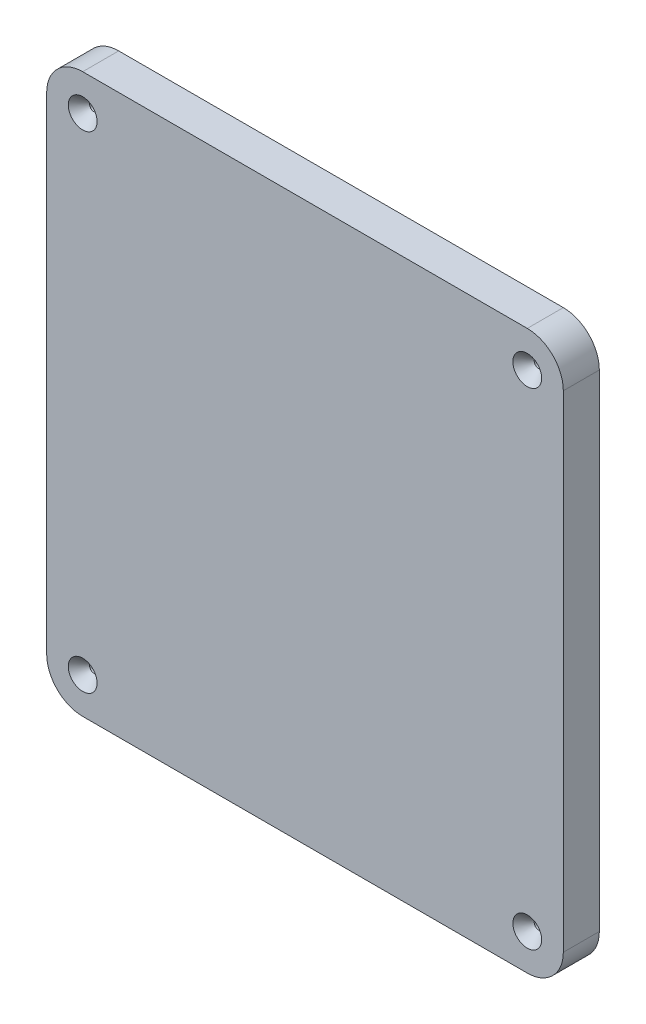
ISO-10303-21;
HEADER;
FILE_DESCRIPTION(('STEP AP214'),'2;1');
FILE_NAME('part.step','',(''),(''),'','','');
FILE_SCHEMA(('AUTOMOTIVE_DESIGN { 1 0 10303 214 1 1 1 1 }'));
ENDSEC;
DATA;
#1=APPLICATION_CONTEXT('core data for automotive mechanical design processes');
#2=APPLICATION_PROTOCOL_DEFINITION('international standard','automotive_design',2000,#1);
#3=PRODUCT_CONTEXT('',#1,'mechanical');
#4=PRODUCT('Part','Part','',(#3));
#5=PRODUCT_RELATED_PRODUCT_CATEGORY('part','',(#4));
#6=PRODUCT_DEFINITION_FORMATION('','',#4);
#7=PRODUCT_DEFINITION_CONTEXT('part definition',#1,'design');
#8=PRODUCT_DEFINITION('design','',#6,#7);
#9=PRODUCT_DEFINITION_SHAPE('','',#8);
#10=(LENGTH_UNIT() NAMED_UNIT(*) SI_UNIT(.MILLI.,.METRE.));
#11=(NAMED_UNIT(*) PLANE_ANGLE_UNIT() SI_UNIT($,.RADIAN.));
#12=(NAMED_UNIT(*) SI_UNIT($,.STERADIAN.) SOLID_ANGLE_UNIT());
#13=UNCERTAINTY_MEASURE_WITH_UNIT(LENGTH_MEASURE(1.E-05),#10,'distance_accuracy_value','');
#14=(GEOMETRIC_REPRESENTATION_CONTEXT(3) GLOBAL_UNCERTAINTY_ASSIGNED_CONTEXT((#13)) GLOBAL_UNIT_ASSIGNED_CONTEXT((#10,
#11,#12)) REPRESENTATION_CONTEXT('',''));
#15=CARTESIAN_POINT('',(0.,0.,0.));
#16=DIRECTION('',(0.,0.,1.));
#17=DIRECTION('',(1.,0.,0.));
#18=AXIS2_PLACEMENT_3D('',#15,#16,#17);
#19=CARTESIAN_POINT('',(-43.099999993993,668.077163009698,12.7));
#20=DIRECTION('',(0.,1.,0.));
#21=DIRECTION('',(-1.,0.,0.));
#22=AXIS2_PLACEMENT_3D('',#19,#20,#21);
#23=PLANE('',#22);
#24=DIRECTION('',(1.,0.,0.));
#25=VECTOR('',#24,1.);
#26=CARTESIAN_POINT('',(-43.099999993993,668.077163009698,0.));
#27=LINE('',#26,#25);
#28=CARTESIAN_POINT('',(-30.3999999939932,668.077163009698,0.));
#29=VERTEX_POINT('',#28);
#30=CARTESIAN_POINT('',(126.350000000009,668.077163009696,0.));
#31=VERTEX_POINT('',#30);
#32=EDGE_CURVE('E135',#29,#31,#27,.T.);
#33=ORIENTED_EDGE('',*,*,#32,.T.);
#34=DIRECTION('',(0.,0.,-1.));
#35=VECTOR('',#34,1.);
#36=CARTESIAN_POINT('',(126.350000000009,668.077163009696,12.7));
#37=LINE('',#36,#35);
#38=CARTESIAN_POINT('',(126.350000000009,668.077163009696,12.7));
#39=VERTEX_POINT('',#38);
#40=EDGE_CURVE('E158',#31,#39,#37,.F.);
#41=ORIENTED_EDGE('',*,*,#40,.T.);
#42=DIRECTION('',(1.,0.,0.));
#43=VECTOR('',#42,1.);
#44=CARTESIAN_POINT('',(-43.099999993993,668.077163009698,12.7));
#45=LINE('',#44,#43);
#46=CARTESIAN_POINT('',(-30.3999999939932,668.077163009698,12.7));
#47=VERTEX_POINT('',#46);
#48=EDGE_CURVE('E133',#47,#39,#45,.T.);
#49=ORIENTED_EDGE('',*,*,#48,.F.);
#50=DIRECTION('',(0.,0.,-1.));
#51=VECTOR('',#50,1.);
#52=CARTESIAN_POINT('',(-30.3999999939932,668.077163009698,12.7));
#53=LINE('',#52,#51);
#54=EDGE_CURVE('E155',#47,#29,#53,.T.);
#55=ORIENTED_EDGE('',*,*,#54,.T.);
#56=EDGE_LOOP('',(#33,#41,#49,#55));
#57=FACE_BOUND('',#56,.T.);
#58=ADVANCED_FACE('F38',(#57),#23,.F.);
#59=CARTESIAN_POINT('',(139.050000000009,668.077163009696,12.7));
#60=DIRECTION('',(-1.,0.,0.));
#61=DIRECTION('',(0.,-1.,0.));
#62=AXIS2_PLACEMENT_3D('',#59,#60,#61);
#63=PLANE('',#62);
#64=DIRECTION('',(0.,1.,0.));
#65=VECTOR('',#64,1.);
#66=CARTESIAN_POINT('',(139.050000000009,668.077163009696,0.));
#67=LINE('',#66,#65);
#68=CARTESIAN_POINT('',(139.050000000009,680.777163009696,0.));
#69=VERTEX_POINT('',#68);
#70=CARTESIAN_POINT('',(139.050000000009,852.227163009696,0.));
#71=VERTEX_POINT('',#70);
#72=EDGE_CURVE('E131',#69,#71,#67,.T.);
#73=ORIENTED_EDGE('',*,*,#72,.T.);
#74=DIRECTION('',(0.,0.,-1.));
#75=VECTOR('',#74,1.);
#76=CARTESIAN_POINT('',(139.050000000009,852.227163009696,12.7));
#77=LINE('',#76,#75);
#78=CARTESIAN_POINT('',(139.050000000009,852.227163009696,12.7));
#79=VERTEX_POINT('',#78);
#80=EDGE_CURVE('E110',#71,#79,#77,.F.);
#81=ORIENTED_EDGE('',*,*,#80,.T.);
#82=DIRECTION('',(0.,1.,0.));
#83=VECTOR('',#82,1.);
#84=CARTESIAN_POINT('',(139.050000000009,668.077163009696,12.7));
#85=LINE('',#84,#83);
#86=CARTESIAN_POINT('',(139.050000000009,680.777163009696,12.7));
#87=VERTEX_POINT('',#86);
#88=EDGE_CURVE('E195',#87,#79,#85,.T.);
#89=ORIENTED_EDGE('',*,*,#88,.F.);
#90=DIRECTION('',(0.,0.,-1.));
#91=VECTOR('',#90,1.);
#92=CARTESIAN_POINT('',(139.050000000009,680.777163009696,12.7));
#93=LINE('',#92,#91);
#94=EDGE_CURVE('E115',#87,#69,#93,.T.);
#95=ORIENTED_EDGE('',*,*,#94,.T.);
#96=EDGE_LOOP('',(#73,#81,#89,#95));
#97=FACE_BOUND('',#96,.T.);
#98=ADVANCED_FACE('F212',(#97),#63,.F.);
#99=CARTESIAN_POINT('',(139.050000000009,864.927163009696,12.7));
#100=DIRECTION('',(0.,-1.,0.));
#101=DIRECTION('',(1.,0.,0.));
#102=AXIS2_PLACEMENT_3D('',#99,#100,#101);
#103=PLANE('',#102);
#104=DIRECTION('',(-1.,0.,0.));
#105=VECTOR('',#104,1.);
#106=CARTESIAN_POINT('',(139.050000000009,864.927163009696,12.7));
#107=LINE('',#106,#105);
#108=CARTESIAN_POINT('',(126.350000000009,864.927163009696,12.7));
#109=VERTEX_POINT('',#108);
#110=CARTESIAN_POINT('',(-30.3999999939928,864.927163009698,12.7));
#111=VERTEX_POINT('',#110);
#112=EDGE_CURVE('E124',#109,#111,#107,.T.);
#113=ORIENTED_EDGE('',*,*,#112,.F.);
#114=DIRECTION('',(0.,0.,-1.));
#115=VECTOR('',#114,1.);
#116=CARTESIAN_POINT('',(126.350000000009,864.927163009696,12.7));
#117=LINE('',#116,#115);
#118=CARTESIAN_POINT('',(126.350000000009,864.927163009696,0.));
#119=VERTEX_POINT('',#118);
#120=EDGE_CURVE('E109',#109,#119,#117,.T.);
#121=ORIENTED_EDGE('',*,*,#120,.T.);
#122=DIRECTION('',(-1.,0.,0.));
#123=VECTOR('',#122,1.);
#124=CARTESIAN_POINT('',(139.050000000009,864.927163009696,0.));
#125=LINE('',#124,#123);
#126=CARTESIAN_POINT('',(-30.3999999939928,864.927163009698,0.));
#127=VERTEX_POINT('',#126);
#128=EDGE_CURVE('E122',#119,#127,#125,.T.);
#129=ORIENTED_EDGE('',*,*,#128,.T.);
#130=DIRECTION('',(0.,0.,-1.));
#131=VECTOR('',#130,1.);
#132=CARTESIAN_POINT('',(-30.3999999939928,864.927163009698,12.7));
#133=LINE('',#132,#131);
#134=EDGE_CURVE('E126',#127,#111,#133,.F.);
#135=ORIENTED_EDGE('',*,*,#134,.T.);
#136=EDGE_LOOP('',(#113,#121,#129,#135));
#137=FACE_BOUND('',#136,.T.);
#138=ADVANCED_FACE('F121',(#137),#103,.F.);
#139=CARTESIAN_POINT('',(-43.099999993993,864.927163009698,12.7));
#140=DIRECTION('',(1.,0.,0.));
#141=DIRECTION('',(0.,1.,0.));
#142=AXIS2_PLACEMENT_3D('',#139,#140,#141);
#143=PLANE('',#142);
#144=DIRECTION('',(0.,-1.,0.));
#145=VECTOR('',#144,1.);
#146=CARTESIAN_POINT('',(-43.099999993993,864.927163009698,0.));
#147=LINE('',#146,#145);
#148=CARTESIAN_POINT('',(-43.099999993993,852.227163009698,0.));
#149=VERTEX_POINT('',#148);
#150=CARTESIAN_POINT('',(-43.099999993993,680.777163009698,0.));
#151=VERTEX_POINT('',#150);
#152=EDGE_CURVE('E130',#149,#151,#147,.T.);
#153=ORIENTED_EDGE('',*,*,#152,.T.);
#154=DIRECTION('',(0.,0.,-1.));
#155=VECTOR('',#154,1.);
#156=CARTESIAN_POINT('',(-43.099999993993,680.777163009698,12.7));
#157=LINE('',#156,#155);
#158=CARTESIAN_POINT('',(-43.099999993993,680.777163009698,12.7));
#159=VERTEX_POINT('',#158);
#160=EDGE_CURVE('E11',#151,#159,#157,.F.);
#161=ORIENTED_EDGE('',*,*,#160,.T.);
#162=DIRECTION('',(0.,-1.,0.));
#163=VECTOR('',#162,1.);
#164=CARTESIAN_POINT('',(-43.099999993993,864.927163009698,12.7));
#165=LINE('',#164,#163);
#166=CARTESIAN_POINT('',(-43.099999993993,852.227163009698,12.7));
#167=VERTEX_POINT('',#166);
#168=EDGE_CURVE('E139',#167,#159,#165,.T.);
#169=ORIENTED_EDGE('',*,*,#168,.F.);
#170=DIRECTION('',(0.,0.,-1.));
#171=VECTOR('',#170,1.);
#172=CARTESIAN_POINT('',(-43.099999993993,852.227163009698,12.7));
#173=LINE('',#172,#171);
#174=EDGE_CURVE('E47',#167,#149,#173,.T.);
#175=ORIENTED_EDGE('',*,*,#174,.T.);
#176=EDGE_LOOP('',(#153,#161,#169,#175));
#177=FACE_BOUND('',#176,.T.);
#178=ADVANCED_FACE('F219',(#177),#143,.F.);
#179=CARTESIAN_POINT('',(0.,0.,12.7));
#180=DIRECTION('',(0.,0.,1.));
#181=DIRECTION('',(1.,0.,0.));
#182=AXIS2_PLACEMENT_3D('',#179,#180,#181);
#183=PLANE('',#182);
#184=CARTESIAN_POINT('',(-30.399999993993,852.227163009698,12.7000000000003));
#185=DIRECTION('',(0.,0.,1.));
#186=DIRECTION('',(1.,0.,0.));
#187=AXIS2_PLACEMENT_3D('',#184,#185,#186);
#188=CIRCLE('',#187,5.08);
#189=CARTESIAN_POINT('',(-25.319999993993,852.227163009698,12.7000000000003));
#190=VERTEX_POINT('',#189);
#191=EDGE_CURVE('E285',#190,#190,#188,.T.);
#192=ORIENTED_EDGE('',*,*,#191,.F.);
#193=EDGE_LOOP('',(#192));
#194=FACE_BOUND('',#193,.T.);
#195=CARTESIAN_POINT('',(-30.399999993993,680.777163009698,12.7000000000003));
#196=DIRECTION('',(0.,0.,1.));
#197=DIRECTION('',(1.,0.,0.));
#198=AXIS2_PLACEMENT_3D('',#195,#196,#197);
#199=CIRCLE('',#198,5.08);
#200=CARTESIAN_POINT('',(-25.319999993993,680.777163009698,12.7000000000003));
#201=VERTEX_POINT('',#200);
#202=EDGE_CURVE('E179',#201,#201,#199,.T.);
#203=ORIENTED_EDGE('',*,*,#202,.F.);
#204=EDGE_LOOP('',(#203));
#205=FACE_BOUND('',#204,.T.);
#206=CARTESIAN_POINT('',(126.350000000009,680.777163009696,12.7000000000003));
#207=DIRECTION('',(0.,0.,1.));
#208=DIRECTION('',(1.,0.,0.));
#209=AXIS2_PLACEMENT_3D('',#206,#207,#208);
#210=CIRCLE('',#209,5.08);
#211=CARTESIAN_POINT('',(131.430000000009,680.777163009696,12.7000000000003));
#212=VERTEX_POINT('',#211);
#213=EDGE_CURVE('E172',#212,#212,#210,.T.);
#214=ORIENTED_EDGE('',*,*,#213,.F.);
#215=EDGE_LOOP('',(#214));
#216=FACE_BOUND('',#215,.T.);
#217=CARTESIAN_POINT('',(126.350000000009,852.227163009696,12.7000000000003));
#218=DIRECTION('',(0.,0.,1.));
#219=DIRECTION('',(1.,0.,0.));
#220=AXIS2_PLACEMENT_3D('',#217,#218,#219);
#221=CIRCLE('',#220,5.08);
#222=CARTESIAN_POINT('',(131.430000000009,852.227163009696,12.7000000000003));
#223=VERTEX_POINT('',#222);
#224=EDGE_CURVE('E168',#223,#223,#221,.T.);
#225=ORIENTED_EDGE('',*,*,#224,.F.);
#226=EDGE_LOOP('',(#225));
#227=FACE_BOUND('',#226,.T.);
#228=ORIENTED_EDGE('',*,*,#88,.T.);
#229=CARTESIAN_POINT('',(126.350000000009,852.227163009696,12.7));
#230=DIRECTION('',(0.,0.,1.));
#231=DIRECTION('',(1.,0.,0.));
#232=AXIS2_PLACEMENT_3D('',#229,#230,#231);
#233=CIRCLE('',#232,12.7);
#234=EDGE_CURVE('E153',#79,#109,#233,.T.);
#235=ORIENTED_EDGE('',*,*,#234,.T.);
#236=ORIENTED_EDGE('',*,*,#112,.T.);
#237=CARTESIAN_POINT('',(-30.399999993993,852.227163009698,12.7));
#238=DIRECTION('',(0.,0.,1.));
#239=DIRECTION('',(1.,0.,0.));
#240=AXIS2_PLACEMENT_3D('',#237,#238,#239);
#241=CIRCLE('',#240,12.7);
#242=EDGE_CURVE('E60',#111,#167,#241,.T.);
#243=ORIENTED_EDGE('',*,*,#242,.T.);
#244=ORIENTED_EDGE('',*,*,#168,.T.);
#245=CARTESIAN_POINT('',(-30.399999993993,680.777163009698,12.7));
#246=DIRECTION('',(0.,0.,1.));
#247=DIRECTION('',(1.,0.,0.));
#248=AXIS2_PLACEMENT_3D('',#245,#246,#247);
#249=CIRCLE('',#248,12.7);
#250=EDGE_CURVE('E149',#159,#47,#249,.T.);
#251=ORIENTED_EDGE('',*,*,#250,.T.);
#252=ORIENTED_EDGE('',*,*,#48,.T.);
#253=CARTESIAN_POINT('',(126.350000000009,680.777163009696,12.7));
#254=DIRECTION('',(0.,0.,1.));
#255=DIRECTION('',(1.,0.,0.));
#256=AXIS2_PLACEMENT_3D('',#253,#254,#255);
#257=CIRCLE('',#256,12.7);
#258=EDGE_CURVE('E151',#39,#87,#257,.T.);
#259=ORIENTED_EDGE('',*,*,#258,.T.);
#260=EDGE_LOOP('',(#228,#235,#236,#243,#244,#251,#252,#259));
#261=FACE_BOUND('',#260,.T.);
#262=ADVANCED_FACE('F210',(#194,#205,#216,#227,#261),#183,.T.);
#263=CARTESIAN_POINT('',(0.,0.,0.));
#264=DIRECTION('',(0.,0.,1.));
#265=DIRECTION('',(1.,0.,0.));
#266=AXIS2_PLACEMENT_3D('',#263,#264,#265);
#267=PLANE('',#266);
#268=CARTESIAN_POINT('',(-30.399999993993,852.227163009698,0.));
#269=DIRECTION('',(0.,0.,1.));
#270=DIRECTION('',(1.,0.,0.));
#271=AXIS2_PLACEMENT_3D('',#268,#269,#270);
#272=CIRCLE('',#271,1.5875);
#273=CARTESIAN_POINT('',(-28.812499993993,852.227163009698,0.));
#274=VERTEX_POINT('',#273);
#275=EDGE_CURVE('E42',#274,#274,#272,.T.);
#276=ORIENTED_EDGE('',*,*,#275,.T.);
#277=EDGE_LOOP('',(#276));
#278=FACE_BOUND('',#277,.T.);
#279=CARTESIAN_POINT('',(-30.399999993993,680.777163009698,0.));
#280=DIRECTION('',(0.,0.,1.));
#281=DIRECTION('',(1.,0.,0.));
#282=AXIS2_PLACEMENT_3D('',#279,#280,#281);
#283=CIRCLE('',#282,1.5875);
#284=CARTESIAN_POINT('',(-28.812499993993,680.777163009698,0.));
#285=VERTEX_POINT('',#284);
#286=EDGE_CURVE('E170',#285,#285,#283,.T.);
#287=ORIENTED_EDGE('',*,*,#286,.T.);
#288=EDGE_LOOP('',(#287));
#289=FACE_BOUND('',#288,.T.);
#290=CARTESIAN_POINT('',(126.350000000009,680.777163009696,0.));
#291=DIRECTION('',(0.,0.,1.));
#292=DIRECTION('',(1.,0.,0.));
#293=AXIS2_PLACEMENT_3D('',#290,#291,#292);
#294=CIRCLE('',#293,1.58750000000001);
#295=CARTESIAN_POINT('',(127.937500000009,680.777163009696,0.));
#296=VERTEX_POINT('',#295);
#297=EDGE_CURVE('E166',#296,#296,#294,.T.);
#298=ORIENTED_EDGE('',*,*,#297,.T.);
#299=EDGE_LOOP('',(#298));
#300=FACE_BOUND('',#299,.T.);
#301=CARTESIAN_POINT('',(126.350000000009,852.227163009696,0.));
#302=DIRECTION('',(0.,0.,1.));
#303=DIRECTION('',(1.,0.,0.));
#304=AXIS2_PLACEMENT_3D('',#301,#302,#303);
#305=CIRCLE('',#304,1.58749999999999);
#306=CARTESIAN_POINT('',(127.937500000009,852.227163009696,0.));
#307=VERTEX_POINT('',#306);
#308=EDGE_CURVE('E162',#307,#307,#305,.T.);
#309=ORIENTED_EDGE('',*,*,#308,.T.);
#310=EDGE_LOOP('',(#309));
#311=FACE_BOUND('',#310,.T.);
#312=ORIENTED_EDGE('',*,*,#128,.F.);
#313=CARTESIAN_POINT('',(126.350000000009,852.227163009696,0.));
#314=DIRECTION('',(0.,0.,1.));
#315=DIRECTION('',(1.,0.,0.));
#316=AXIS2_PLACEMENT_3D('',#313,#314,#315);
#317=CIRCLE('',#316,12.7);
#318=EDGE_CURVE('E105',#119,#71,#317,.F.);
#319=ORIENTED_EDGE('',*,*,#318,.T.);
#320=ORIENTED_EDGE('',*,*,#72,.F.);
#321=CARTESIAN_POINT('',(126.350000000009,680.777163009696,0.));
#322=DIRECTION('',(0.,0.,1.));
#323=DIRECTION('',(1.,0.,0.));
#324=AXIS2_PLACEMENT_3D('',#321,#322,#323);
#325=CIRCLE('',#324,12.7);
#326=EDGE_CURVE('E116',#69,#31,#325,.F.);
#327=ORIENTED_EDGE('',*,*,#326,.T.);
#328=ORIENTED_EDGE('',*,*,#32,.F.);
#329=CARTESIAN_POINT('',(-30.399999993993,680.777163009698,0.));
#330=DIRECTION('',(0.,0.,1.));
#331=DIRECTION('',(1.,0.,0.));
#332=AXIS2_PLACEMENT_3D('',#329,#330,#331);
#333=CIRCLE('',#332,12.7);
#334=EDGE_CURVE('E142',#29,#151,#333,.F.);
#335=ORIENTED_EDGE('',*,*,#334,.T.);
#336=ORIENTED_EDGE('',*,*,#152,.F.);
#337=CARTESIAN_POINT('',(-30.399999993993,852.227163009698,0.));
#338=DIRECTION('',(0.,0.,1.));
#339=DIRECTION('',(1.,0.,0.));
#340=AXIS2_PLACEMENT_3D('',#337,#338,#339);
#341=CIRCLE('',#340,12.7);
#342=EDGE_CURVE('E125',#149,#127,#341,.F.);
#343=ORIENTED_EDGE('',*,*,#342,.T.);
#344=EDGE_LOOP('',(#312,#319,#320,#327,#328,#335,#336,#343));
#345=FACE_BOUND('',#344,.T.);
#346=ADVANCED_FACE('F128',(#278,#289,#300,#311,#345),#267,.F.);
#347=CARTESIAN_POINT('',(126.350000000009,852.227163009696,12.7));
#348=DIRECTION('',(0.,0.,-1.));
#349=DIRECTION('',(-1.,0.,0.));
#350=AXIS2_PLACEMENT_3D('',#347,#348,#349);
#351=CYLINDRICAL_SURFACE('',#350,12.7);
#352=ORIENTED_EDGE('',*,*,#234,.F.);
#353=ORIENTED_EDGE('',*,*,#80,.F.);
#354=ORIENTED_EDGE('',*,*,#318,.F.);
#355=ORIENTED_EDGE('',*,*,#120,.F.);
#356=EDGE_LOOP('',(#352,#353,#354,#355));
#357=FACE_BOUND('',#356,.T.);
#358=ADVANCED_FACE('F108',(#357),#351,.T.);
#359=CARTESIAN_POINT('',(126.350000000009,680.777163009696,12.7));
#360=DIRECTION('',(0.,0.,-1.));
#361=DIRECTION('',(-1.,0.,0.));
#362=AXIS2_PLACEMENT_3D('',#359,#360,#361);
#363=CYLINDRICAL_SURFACE('',#362,12.7);
#364=ORIENTED_EDGE('',*,*,#258,.F.);
#365=ORIENTED_EDGE('',*,*,#40,.F.);
#366=ORIENTED_EDGE('',*,*,#326,.F.);
#367=ORIENTED_EDGE('',*,*,#94,.F.);
#368=EDGE_LOOP('',(#364,#365,#366,#367));
#369=FACE_BOUND('',#368,.T.);
#370=ADVANCED_FACE('F207',(#369),#363,.T.);
#371=CARTESIAN_POINT('',(-30.399999993993,680.777163009698,12.7));
#372=DIRECTION('',(0.,0.,-1.));
#373=DIRECTION('',(-1.,0.,0.));
#374=AXIS2_PLACEMENT_3D('',#371,#372,#373);
#375=CYLINDRICAL_SURFACE('',#374,12.7);
#376=ORIENTED_EDGE('',*,*,#250,.F.);
#377=ORIENTED_EDGE('',*,*,#160,.F.);
#378=ORIENTED_EDGE('',*,*,#334,.F.);
#379=ORIENTED_EDGE('',*,*,#54,.F.);
#380=EDGE_LOOP('',(#376,#377,#378,#379));
#381=FACE_BOUND('',#380,.T.);
#382=ADVANCED_FACE('F227',(#381),#375,.T.);
#383=CARTESIAN_POINT('',(-30.399999993993,852.227163009698,12.7));
#384=DIRECTION('',(0.,0.,-1.));
#385=DIRECTION('',(-1.,0.,0.));
#386=AXIS2_PLACEMENT_3D('',#383,#384,#385);
#387=CYLINDRICAL_SURFACE('',#386,12.7);
#388=ORIENTED_EDGE('',*,*,#242,.F.);
#389=ORIENTED_EDGE('',*,*,#134,.F.);
#390=ORIENTED_EDGE('',*,*,#342,.F.);
#391=ORIENTED_EDGE('',*,*,#174,.F.);
#392=EDGE_LOOP('',(#388,#389,#390,#391));
#393=FACE_BOUND('',#392,.T.);
#394=ADVANCED_FACE('F40',(#393),#387,.T.);
#395=CARTESIAN_POINT('',(126.350000000009,852.227163009696,12.7000000000003));
#396=DIRECTION('',(0.,0.,1.));
#397=DIRECTION('',(1.,0.,0.));
#398=AXIS2_PLACEMENT_3D('',#395,#396,#397);
#399=CYLINDRICAL_SURFACE('',#398,1.58749999999999);
#400=CARTESIAN_POINT('',(126.350000000009,852.227163009696,8.68233833778091));
#401=DIRECTION('',(0.,0.,1.));
#402=DIRECTION('',(1.,0.,0.));
#403=AXIS2_PLACEMENT_3D('',#400,#401,#402);
#404=CIRCLE('',#403,1.58749999999999);
#405=CARTESIAN_POINT('',(127.937500000009,852.227163009696,8.6823383377809));
#406=VERTEX_POINT('',#405);
#407=EDGE_CURVE('E165',#406,#406,#404,.T.);
#408=ORIENTED_EDGE('',*,*,#407,.T.);
#409=EDGE_LOOP('',(#408));
#410=FACE_BOUND('',#409,.T.);
#411=ORIENTED_EDGE('',*,*,#308,.F.);
#412=EDGE_LOOP('',(#411));
#413=FACE_BOUND('',#412,.T.);
#414=ADVANCED_FACE('F233',(#410,#413),#399,.F.);
#415=CARTESIAN_POINT('',(126.350000000009,852.227163009696,12.7000000000003));
#416=DIRECTION('',(0.,0.,1.));
#417=DIRECTION('',(1.,0.,0.));
#418=AXIS2_PLACEMENT_3D('',#415,#416,#417);
#419=CONICAL_SURFACE('',#418,5.08,0.715584993317678);
#420=CARTESIAN_POINT('',(127.937500000009,852.227163009696,8.6823383377809));
#421=CARTESIAN_POINT('',(127.973880208342,852.227163009696,8.72418898009569));
#422=CARTESIAN_POINT('',(128.010260416676,852.227163009696,8.76603962241047));
#423=CARTESIAN_POINT('',(128.083020833342,852.227163009696,8.84974090704004));
#424=CARTESIAN_POINT('',(128.119401041676,852.227163009696,8.89159154935483));
#425=CARTESIAN_POINT('',(128.192161458342,852.227163009696,8.9752928339844));
#426=CARTESIAN_POINT('',(128.228541666676,852.227163009696,9.01714347629918));
#427=CARTESIAN_POINT('',(128.301302083342,852.227163009696,9.10084476092875));
#428=CARTESIAN_POINT('',(128.337682291676,852.227163009696,9.14269540324354));
#429=CARTESIAN_POINT('',(128.410442708342,852.227163009696,9.22639668787311));
#430=CARTESIAN_POINT('',(128.446822916676,852.227163009696,9.2682473301879));
#431=CARTESIAN_POINT('',(128.519583333342,852.227163009696,9.35194861481746));
#432=CARTESIAN_POINT('',(128.555963541676,852.227163009696,9.39379925713225));
#433=CARTESIAN_POINT('',(128.628723958342,852.227163009696,9.47750054176182));
#434=CARTESIAN_POINT('',(128.665104166676,852.227163009696,9.5193511840766));
#435=CARTESIAN_POINT('',(128.737864583342,852.227163009696,9.60305246870617));
#436=CARTESIAN_POINT('',(128.774244791676,852.227163009696,9.64490311102096));
#437=CARTESIAN_POINT('',(128.847005208342,852.227163009696,9.72860439565053));
#438=CARTESIAN_POINT('',(128.883385416676,852.227163009696,9.77045503796531));
#439=CARTESIAN_POINT('',(128.956145833342,852.227163009696,9.85415632259489));
#440=CARTESIAN_POINT('',(128.992526041676,852.227163009696,9.89600696490967));
#441=CARTESIAN_POINT('',(129.065286458342,852.227163009696,9.97970824953924));
#442=CARTESIAN_POINT('',(129.101666666676,852.227163009696,10.021558891854));
#443=CARTESIAN_POINT('',(129.174427083342,852.227163009696,10.1052601764836));
#444=CARTESIAN_POINT('',(129.210807291676,852.227163009696,10.1471108187984));
#445=CARTESIAN_POINT('',(129.283567708342,852.227163009696,10.230812103428));
#446=CARTESIAN_POINT('',(129.319947916676,852.227163009696,10.2726627457427));
#447=CARTESIAN_POINT('',(129.392708333342,852.227163009696,10.3563640303723));
#448=CARTESIAN_POINT('',(129.429088541676,852.227163009696,10.3982146726871));
#449=CARTESIAN_POINT('',(129.501848958342,852.227163009696,10.4819159573167));
#450=CARTESIAN_POINT('',(129.538229166676,852.227163009696,10.5237665996314));
#451=CARTESIAN_POINT('',(129.610989583342,852.227163009696,10.607467884261));
#452=CARTESIAN_POINT('',(129.647369791676,852.227163009696,10.6493185265758));
#453=CARTESIAN_POINT('',(129.720130208342,852.227163009696,10.7330198112054));
#454=CARTESIAN_POINT('',(129.756510416676,852.227163009696,10.7748704535202));
#455=CARTESIAN_POINT('',(129.829270833342,852.227163009696,10.8585717381497));
#456=CARTESIAN_POINT('',(129.865651041676,852.227163009696,10.9004223804645));
#457=CARTESIAN_POINT('',(129.938411458342,852.227163009696,10.9841236650941));
#458=CARTESIAN_POINT('',(129.974791666676,852.227163009696,11.0259743074089));
#459=CARTESIAN_POINT('',(130.047552083342,852.227163009696,11.1096755920384));
#460=CARTESIAN_POINT('',(130.083932291676,852.227163009696,11.1515262343532));
#461=CARTESIAN_POINT('',(130.156692708342,852.227163009696,11.2352275189828));
#462=CARTESIAN_POINT('',(130.193072916676,852.227163009696,11.2770781612976));
#463=CARTESIAN_POINT('',(130.265833333342,852.227163009696,11.3607794459271));
#464=CARTESIAN_POINT('',(130.302213541676,852.227163009696,11.4026300882419));
#465=CARTESIAN_POINT('',(130.374973958342,852.227163009696,11.4863313728715));
#466=CARTESIAN_POINT('',(130.411354166676,852.227163009696,11.5281820151863));
#467=CARTESIAN_POINT('',(130.484114583342,852.227163009696,11.6118832998159));
#468=CARTESIAN_POINT('',(130.520494791676,852.227163009696,11.6537339421306));
#469=CARTESIAN_POINT('',(130.593255208342,852.227163009696,11.7374352267602));
#470=CARTESIAN_POINT('',(130.629635416676,852.227163009696,11.779285869075));
#471=CARTESIAN_POINT('',(130.702395833342,852.227163009696,11.8629871537046));
#472=CARTESIAN_POINT('',(130.738776041676,852.227163009696,11.9048377960194));
#473=CARTESIAN_POINT('',(130.811536458342,852.227163009696,11.9885390806489));
#474=CARTESIAN_POINT('',(130.847916666676,852.227163009696,12.0303897229637));
#475=CARTESIAN_POINT('',(130.920677083342,852.227163009696,12.1140910075933));
#476=CARTESIAN_POINT('',(130.957057291676,852.227163009696,12.1559416499081));
#477=CARTESIAN_POINT('',(131.029817708342,852.227163009696,12.2396429345376));
#478=CARTESIAN_POINT('',(131.066197916676,852.227163009696,12.2814935768524));
#479=CARTESIAN_POINT('',(131.138958333342,852.227163009696,12.365194861482));
#480=CARTESIAN_POINT('',(131.175338541676,852.227163009696,12.4070455037968));
#481=CARTESIAN_POINT('',(131.248098958342,852.227163009696,12.4907467884263));
#482=CARTESIAN_POINT('',(131.284479166676,852.227163009696,12.5325974307411));
#483=CARTESIAN_POINT('',(131.357239583342,852.227163009696,12.6162987153707));
#484=CARTESIAN_POINT('',(131.393619791676,852.227163009696,12.6581493576855));
#485=CARTESIAN_POINT('',(131.430000000009,852.227163009696,12.7000000000003));
#486=B_SPLINE_CURVE_WITH_KNOTS('',3,(#420,#421,#422,#423,#424,#425,#426,#427,#428,#429,#430,
#431,#432,#433,#434,#435,#436,#437,#438,#439,#440,#441,#442,#443,#444,#445,#446,#447,#448,#449,
#450,#451,#452,#453,#454,#455,#456,#457,#458,#459,#460,#461,#462,#463,#464,#465,#466,#467,#468,
#469,#470,#471,#472,#473,#474,#475,#476,#477,#478,#479,#480,#481,#482,#483,#484,#485),
.UNSPECIFIED.,.F.,.F.,(4,2,2,2,2,2,2,2,2,2,2,2,2,2,2,2,2,2,2,2,2,2,2,2,2,2,2,2,2,2,2,2,4),(0.,
0.166357934541253,0.332715869082508,0.499073803623762,0.665431738164998,0.831789672706251,
0.998147607247506,1.16450554178876,1.33086347633001,1.49722141087127,1.66357934541252,
1.82993727995377,1.99629521449501,2.16265314903627,2.32901108357752,2.49536901811877,
2.66172695266003,2.82808488720128,2.99444282174253,3.16080075628379,3.32715869082503,
3.49351662536628,3.65987455990753,3.82623249444879,3.99259042899004,4.15894836353129,
4.32530629807255,4.4916642326138,4.65802216715504,4.82438010169629,4.99073803623755,
5.1570959707788,5.32345390532005),.UNSPECIFIED.);
#487=EDGE_CURVE('BSEAM250',#406,#223,#486,.T.);
#488=ORIENTED_EDGE('',*,*,#407,.F.);
#489=ORIENTED_EDGE('',*,*,#224,.T.);
#490=ORIENTED_EDGE('',*,*,#487,.T.);
#491=ORIENTED_EDGE('',*,*,#487,.F.);
#492=EDGE_LOOP('',(#488,#490,#489,#491));
#493=FACE_BOUND('',#492,.T.);
#494=ADVANCED_FACE('F250',(#493),#419,.F.);
#495=CARTESIAN_POINT('',(126.350000000009,680.777163009696,12.7000000000003));
#496=DIRECTION('',(0.,0.,1.));
#497=DIRECTION('',(1.,0.,0.));
#498=AXIS2_PLACEMENT_3D('',#495,#496,#497);
#499=CYLINDRICAL_SURFACE('',#498,1.58750000000001);
#500=CARTESIAN_POINT('',(126.350000000009,680.777163009696,8.68233833778091));
#501=DIRECTION('',(0.,0.,1.));
#502=DIRECTION('',(1.,0.,0.));
#503=AXIS2_PLACEMENT_3D('',#500,#501,#502);
#504=CIRCLE('',#503,1.58750000000002);
#505=CARTESIAN_POINT('',(127.937500000009,680.777163009696,8.6823383377809));
#506=VERTEX_POINT('',#505);
#507=EDGE_CURVE('E169',#506,#506,#504,.T.);
#508=ORIENTED_EDGE('',*,*,#507,.T.);
#509=EDGE_LOOP('',(#508));
#510=FACE_BOUND('',#509,.T.);
#511=ORIENTED_EDGE('',*,*,#297,.F.);
#512=EDGE_LOOP('',(#511));
#513=FACE_BOUND('',#512,.T.);
#514=ADVANCED_FACE('F254',(#510,#513),#499,.F.);
#515=CARTESIAN_POINT('',(126.350000000009,680.777163009696,12.7000000000003));
#516=DIRECTION('',(0.,0.,1.));
#517=DIRECTION('',(1.,0.,0.));
#518=AXIS2_PLACEMENT_3D('',#515,#516,#517);
#519=CONICAL_SURFACE('',#518,5.08,0.715584993317674);
#520=CARTESIAN_POINT('',(127.937500000009,680.777163009696,8.6823383377809));
#521=CARTESIAN_POINT('',(127.973880208342,680.777163009696,8.72418898009569));
#522=CARTESIAN_POINT('',(128.010260416676,680.777163009696,8.76603962241047));
#523=CARTESIAN_POINT('',(128.083020833342,680.777163009696,8.84974090704004));
#524=CARTESIAN_POINT('',(128.119401041676,680.777163009696,8.89159154935483));
#525=CARTESIAN_POINT('',(128.192161458342,680.777163009696,8.9752928339844));
#526=CARTESIAN_POINT('',(128.228541666676,680.777163009696,9.01714347629919));
#527=CARTESIAN_POINT('',(128.301302083342,680.777163009696,9.10084476092876));
#528=CARTESIAN_POINT('',(128.337682291676,680.777163009696,9.14269540324354));
#529=CARTESIAN_POINT('',(128.410442708342,680.777163009696,9.22639668787311));
#530=CARTESIAN_POINT('',(128.446822916676,680.777163009696,9.26824733018789));
#531=CARTESIAN_POINT('',(128.519583333342,680.777163009696,9.35194861481746));
#532=CARTESIAN_POINT('',(128.555963541676,680.777163009696,9.39379925713225));
#533=CARTESIAN_POINT('',(128.628723958342,680.777163009696,9.47750054176182));
#534=CARTESIAN_POINT('',(128.665104166676,680.777163009696,9.5193511840766));
#535=CARTESIAN_POINT('',(128.737864583342,680.777163009696,9.60305246870617));
#536=CARTESIAN_POINT('',(128.774244791676,680.777163009696,9.64490311102096));
#537=CARTESIAN_POINT('',(128.847005208342,680.777163009696,9.72860439565053));
#538=CARTESIAN_POINT('',(128.883385416676,680.777163009696,9.77045503796531));
#539=CARTESIAN_POINT('',(128.956145833342,680.777163009696,9.85415632259488));
#540=CARTESIAN_POINT('',(128.992526041676,680.777163009696,9.89600696490967));
#541=CARTESIAN_POINT('',(129.065286458342,680.777163009696,9.97970824953924));
#542=CARTESIAN_POINT('',(129.101666666676,680.777163009696,10.021558891854));
#543=CARTESIAN_POINT('',(129.174427083342,680.777163009696,10.1052601764836));
#544=CARTESIAN_POINT('',(129.210807291676,680.777163009696,10.1471108187984));
#545=CARTESIAN_POINT('',(129.283567708342,680.777163009696,10.230812103428));
#546=CARTESIAN_POINT('',(129.319947916676,680.777163009696,10.2726627457427));
#547=CARTESIAN_POINT('',(129.392708333342,680.777163009696,10.3563640303723));
#548=CARTESIAN_POINT('',(129.429088541676,680.777163009696,10.3982146726871));
#549=CARTESIAN_POINT('',(129.501848958342,680.777163009696,10.4819159573167));
#550=CARTESIAN_POINT('',(129.538229166676,680.777163009696,10.5237665996314));
#551=CARTESIAN_POINT('',(129.610989583342,680.777163009696,10.607467884261));
#552=CARTESIAN_POINT('',(129.647369791676,680.777163009696,10.6493185265758));
#553=CARTESIAN_POINT('',(129.720130208342,680.777163009696,10.7330198112054));
#554=CARTESIAN_POINT('',(129.756510416676,680.777163009696,10.7748704535202));
#555=CARTESIAN_POINT('',(129.829270833342,680.777163009696,10.8585717381497));
#556=CARTESIAN_POINT('',(129.865651041676,680.777163009696,10.9004223804645));
#557=CARTESIAN_POINT('',(129.938411458342,680.777163009696,10.9841236650941));
#558=CARTESIAN_POINT('',(129.974791666676,680.777163009696,11.0259743074089));
#559=CARTESIAN_POINT('',(130.047552083342,680.777163009696,11.1096755920384));
#560=CARTESIAN_POINT('',(130.083932291676,680.777163009696,11.1515262343532));
#561=CARTESIAN_POINT('',(130.156692708342,680.777163009696,11.2352275189828));
#562=CARTESIAN_POINT('',(130.193072916676,680.777163009696,11.2770781612976));
#563=CARTESIAN_POINT('',(130.265833333342,680.777163009696,11.3607794459271));
#564=CARTESIAN_POINT('',(130.302213541676,680.777163009696,11.4026300882419));
#565=CARTESIAN_POINT('',(130.374973958342,680.777163009696,11.4863313728715));
#566=CARTESIAN_POINT('',(130.411354166676,680.777163009696,11.5281820151863));
#567=CARTESIAN_POINT('',(130.484114583342,680.777163009696,11.6118832998159));
#568=CARTESIAN_POINT('',(130.520494791676,680.777163009696,11.6537339421306));
#569=CARTESIAN_POINT('',(130.593255208342,680.777163009696,11.7374352267602));
#570=CARTESIAN_POINT('',(130.629635416676,680.777163009696,11.779285869075));
#571=CARTESIAN_POINT('',(130.702395833342,680.777163009696,11.8629871537046));
#572=CARTESIAN_POINT('',(130.738776041676,680.777163009696,11.9048377960194));
#573=CARTESIAN_POINT('',(130.811536458342,680.777163009696,11.9885390806489));
#574=CARTESIAN_POINT('',(130.847916666676,680.777163009696,12.0303897229637));
#575=CARTESIAN_POINT('',(130.920677083342,680.777163009696,12.1140910075933));
#576=CARTESIAN_POINT('',(130.957057291676,680.777163009696,12.1559416499081));
#577=CARTESIAN_POINT('',(131.029817708342,680.777163009696,12.2396429345376));
#578=CARTESIAN_POINT('',(131.066197916676,680.777163009696,12.2814935768524));
#579=CARTESIAN_POINT('',(131.138958333342,680.777163009696,12.365194861482));
#580=CARTESIAN_POINT('',(131.175338541676,680.777163009696,12.4070455037968));
#581=CARTESIAN_POINT('',(131.248098958342,680.777163009696,12.4907467884263));
#582=CARTESIAN_POINT('',(131.284479166676,680.777163009696,12.5325974307411));
#583=CARTESIAN_POINT('',(131.357239583342,680.777163009696,12.6162987153707));
#584=CARTESIAN_POINT('',(131.393619791676,680.777163009696,12.6581493576855));
#585=CARTESIAN_POINT('',(131.430000000009,680.777163009696,12.7000000000003));
#586=B_SPLINE_CURVE_WITH_KNOTS('',3,(#520,#521,#522,#523,#524,#525,#526,#527,#528,#529,#530,
#531,#532,#533,#534,#535,#536,#537,#538,#539,#540,#541,#542,#543,#544,#545,#546,#547,#548,#549,
#550,#551,#552,#553,#554,#555,#556,#557,#558,#559,#560,#561,#562,#563,#564,#565,#566,#567,#568,
#569,#570,#571,#572,#573,#574,#575,#576,#577,#578,#579,#580,#581,#582,#583,#584,#585),
.UNSPECIFIED.,.F.,.F.,(4,2,2,2,2,2,2,2,2,2,2,2,2,2,2,2,2,2,2,2,2,2,2,2,2,2,2,2,2,2,2,2,4),(0.,
0.166357934541253,0.332715869082508,0.499073803623743,0.665431738164998,0.831789672706251,
0.998147607247506,1.16450554178876,1.33086347633001,1.49722141087127,1.6635793454125,
1.82993727995376,1.99629521449501,2.16265314903627,2.32901108357752,2.49536901811877,
2.66172695266001,2.82808488720126,2.99444282174252,3.16080075628377,3.32715869082503,
3.49351662536628,3.65987455990753,3.82623249444877,3.99259042899002,4.15894836353127,
4.32530629807253,4.49166423261378,4.65802216715504,4.82438010169627,4.99073803623753,
5.15709597077878,5.32345390532003),.UNSPECIFIED.);
#587=EDGE_CURVE('BSEAM258',#506,#212,#586,.T.);
#588=ORIENTED_EDGE('',*,*,#507,.F.);
#589=ORIENTED_EDGE('',*,*,#213,.T.);
#590=ORIENTED_EDGE('',*,*,#587,.T.);
#591=ORIENTED_EDGE('',*,*,#587,.F.);
#592=EDGE_LOOP('',(#588,#590,#589,#591));
#593=FACE_BOUND('',#592,.T.);
#594=ADVANCED_FACE('F258',(#593),#519,.F.);
#595=CARTESIAN_POINT('',(-30.399999993993,680.777163009698,12.7000000000003));
#596=DIRECTION('',(0.,0.,1.));
#597=DIRECTION('',(1.,0.,0.));
#598=AXIS2_PLACEMENT_3D('',#595,#596,#597);
#599=CYLINDRICAL_SURFACE('',#598,1.5875);
#600=CARTESIAN_POINT('',(-30.399999993993,680.777163009698,8.68233833778091));
#601=DIRECTION('',(0.,0.,1.));
#602=DIRECTION('',(1.,0.,0.));
#603=AXIS2_PLACEMENT_3D('',#600,#601,#602);
#604=CIRCLE('',#603,1.58750000000001);
#605=CARTESIAN_POINT('',(-28.812499993993,680.777163009698,8.6823383377809));
#606=VERTEX_POINT('',#605);
#607=EDGE_CURVE('E173',#606,#606,#604,.T.);
#608=ORIENTED_EDGE('',*,*,#607,.T.);
#609=EDGE_LOOP('',(#608));
#610=FACE_BOUND('',#609,.T.);
#611=ORIENTED_EDGE('',*,*,#286,.F.);
#612=EDGE_LOOP('',(#611));
#613=FACE_BOUND('',#612,.T.);
#614=ADVANCED_FACE('F262',(#610,#613),#599,.F.);
#615=CARTESIAN_POINT('',(-30.399999993993,680.777163009698,12.7000000000003));
#616=DIRECTION('',(0.,0.,1.));
#617=DIRECTION('',(1.,0.,0.));
#618=AXIS2_PLACEMENT_3D('',#615,#616,#617);
#619=CONICAL_SURFACE('',#618,5.08,0.715584993317676);
#620=CARTESIAN_POINT('',(-28.812499993993,680.777163009698,8.6823383377809));
#621=CARTESIAN_POINT('',(-28.7761197856597,680.777163009698,8.72418898009569));
#622=CARTESIAN_POINT('',(-28.7397395773264,680.777163009698,8.76603962241047));
#623=CARTESIAN_POINT('',(-28.6669791606597,680.777163009698,8.84974090704004));
#624=CARTESIAN_POINT('',(-28.6305989523264,680.777163009698,8.89159154935483));
#625=CARTESIAN_POINT('',(-28.5578385356597,680.777163009698,8.9752928339844));
#626=CARTESIAN_POINT('',(-28.5214583273264,680.777163009698,9.01714347629918));
#627=CARTESIAN_POINT('',(-28.4486979106597,680.777163009698,9.10084476092876));
#628=CARTESIAN_POINT('',(-28.4123177023264,680.777163009698,9.14269540324354));
#629=CARTESIAN_POINT('',(-28.3395572856597,680.777163009698,9.22639668787311));
#630=CARTESIAN_POINT('',(-28.3031770773264,680.777163009698,9.2682473301879));
#631=CARTESIAN_POINT('',(-28.2304166606597,680.777163009698,9.35194861481746));
#632=CARTESIAN_POINT('',(-28.1940364523264,680.777163009698,9.39379925713225));
#633=CARTESIAN_POINT('',(-28.1212760356597,680.777163009698,9.47750054176182));
#634=CARTESIAN_POINT('',(-28.0848958273264,680.777163009698,9.5193511840766));
#635=CARTESIAN_POINT('',(-28.0121354106597,680.777163009698,9.60305246870617));
#636=CARTESIAN_POINT('',(-27.9757552023264,680.777163009698,9.64490311102096));
#637=CARTESIAN_POINT('',(-27.9029947856597,680.777163009698,9.72860439565053));
#638=CARTESIAN_POINT('',(-27.8666145773264,680.777163009698,9.77045503796531));
#639=CARTESIAN_POINT('',(-27.7938541606597,680.777163009698,9.85415632259488));
#640=CARTESIAN_POINT('',(-27.7574739523264,680.777163009698,9.89600696490967));
#641=CARTESIAN_POINT('',(-27.6847135356597,680.777163009698,9.97970824953924));
#642=CARTESIAN_POINT('',(-27.6483333273264,680.777163009698,10.021558891854));
#643=CARTESIAN_POINT('',(-27.5755729106597,680.777163009698,10.1052601764836));
#644=CARTESIAN_POINT('',(-27.5391927023264,680.777163009698,10.1471108187984));
#645=CARTESIAN_POINT('',(-27.4664322856597,680.777163009698,10.230812103428));
#646=CARTESIAN_POINT('',(-27.4300520773264,680.777163009698,10.2726627457427));
#647=CARTESIAN_POINT('',(-27.3572916606597,680.777163009698,10.3563640303723));
#648=CARTESIAN_POINT('',(-27.3209114523264,680.777163009698,10.3982146726871));
#649=CARTESIAN_POINT('',(-27.2481510356597,680.777163009698,10.4819159573167));
#650=CARTESIAN_POINT('',(-27.2117708273264,680.777163009698,10.5237665996314));
#651=CARTESIAN_POINT('',(-27.1390104106597,680.777163009698,10.607467884261));
#652=CARTESIAN_POINT('',(-27.1026302023264,680.777163009698,10.6493185265758));
#653=CARTESIAN_POINT('',(-27.0298697856597,680.777163009698,10.7330198112054));
#654=CARTESIAN_POINT('',(-26.9934895773264,680.777163009698,10.7748704535202));
#655=CARTESIAN_POINT('',(-26.9207291606597,680.777163009698,10.8585717381497));
#656=CARTESIAN_POINT('',(-26.8843489523264,680.777163009698,10.9004223804645));
#657=CARTESIAN_POINT('',(-26.8115885356597,680.777163009698,10.9841236650941));
#658=CARTESIAN_POINT('',(-26.7752083273264,680.777163009698,11.0259743074089));
#659=CARTESIAN_POINT('',(-26.7024479106597,680.777163009698,11.1096755920384));
#660=CARTESIAN_POINT('',(-26.6660677023264,680.777163009698,11.1515262343532));
#661=CARTESIAN_POINT('',(-26.5933072856597,680.777163009698,11.2352275189828));
#662=CARTESIAN_POINT('',(-26.5569270773264,680.777163009698,11.2770781612976));
#663=CARTESIAN_POINT('',(-26.4841666606597,680.777163009698,11.3607794459271));
#664=CARTESIAN_POINT('',(-26.4477864523264,680.777163009698,11.4026300882419));
#665=CARTESIAN_POINT('',(-26.3750260356597,680.777163009698,11.4863313728715));
#666=CARTESIAN_POINT('',(-26.3386458273264,680.777163009698,11.5281820151863));
#667=CARTESIAN_POINT('',(-26.2658854106597,680.777163009698,11.6118832998159));
#668=CARTESIAN_POINT('',(-26.2295052023264,680.777163009698,11.6537339421306));
#669=CARTESIAN_POINT('',(-26.1567447856597,680.777163009698,11.7374352267602));
#670=CARTESIAN_POINT('',(-26.1203645773264,680.777163009698,11.779285869075));
#671=CARTESIAN_POINT('',(-26.0476041606597,680.777163009698,11.8629871537046));
#672=CARTESIAN_POINT('',(-26.0112239523264,680.777163009698,11.9048377960194));
#673=CARTESIAN_POINT('',(-25.9384635356597,680.777163009698,11.9885390806489));
#674=CARTESIAN_POINT('',(-25.9020833273264,680.777163009698,12.0303897229637));
#675=CARTESIAN_POINT('',(-25.8293229106597,680.777163009698,12.1140910075933));
#676=CARTESIAN_POINT('',(-25.7929427023264,680.777163009698,12.1559416499081));
#677=CARTESIAN_POINT('',(-25.7201822856597,680.777163009698,12.2396429345376));
#678=CARTESIAN_POINT('',(-25.6838020773264,680.777163009698,12.2814935768524));
#679=CARTESIAN_POINT('',(-25.6110416606597,680.777163009698,12.365194861482));
#680=CARTESIAN_POINT('',(-25.5746614523264,680.777163009698,12.4070455037968));
#681=CARTESIAN_POINT('',(-25.5019010356597,680.777163009698,12.4907467884263));
#682=CARTESIAN_POINT('',(-25.4655208273264,680.777163009698,12.5325974307411));
#683=CARTESIAN_POINT('',(-25.3927604106597,680.777163009698,12.6162987153707));
#684=CARTESIAN_POINT('',(-25.3563802023264,680.777163009698,12.6581493576855));
#685=CARTESIAN_POINT('',(-25.319999993993,680.777163009698,12.7000000000003));
#686=B_SPLINE_CURVE_WITH_KNOTS('',3,(#620,#621,#622,#623,#624,#625,#626,#627,#628,#629,#630,
#631,#632,#633,#634,#635,#636,#637,#638,#639,#640,#641,#642,#643,#644,#645,#646,#647,#648,#649,
#650,#651,#652,#653,#654,#655,#656,#657,#658,#659,#660,#661,#662,#663,#664,#665,#666,#667,#668,
#669,#670,#671,#672,#673,#674,#675,#676,#677,#678,#679,#680,#681,#682,#683,#684,#685),
.UNSPECIFIED.,.F.,.F.,(4,2,2,2,2,2,2,2,2,2,2,2,2,2,2,2,2,2,2,2,2,2,2,2,2,2,2,2,2,2,2,2,4),(0.,
0.166357934541251,0.332715869082504,0.499073803623755,0.665431738165007,0.831789672706258,
0.998147607247511,1.16450554178876,1.33086347633001,1.49722141087126,1.66357934541251,
1.82993727995376,1.99629521449502,2.16265314903627,2.32901108357752,2.49536901811877,
2.66172695266002,2.82808488720127,2.99444282174252,3.16080075628378,3.32715869082503,
3.49351662536628,3.65987455990753,3.82623249444878,3.99259042899003,4.15894836353128,
4.32530629807253,4.49166423261379,4.65802216715504,4.82438010169629,4.99073803623754,
5.15709597077879,5.32345390532005),.UNSPECIFIED.);
#687=EDGE_CURVE('BSEAM266',#606,#201,#686,.T.);
#688=ORIENTED_EDGE('',*,*,#607,.F.);
#689=ORIENTED_EDGE('',*,*,#202,.T.);
#690=ORIENTED_EDGE('',*,*,#687,.T.);
#691=ORIENTED_EDGE('',*,*,#687,.F.);
#692=EDGE_LOOP('',(#688,#690,#689,#691));
#693=FACE_BOUND('',#692,.T.);
#694=ADVANCED_FACE('F266',(#693),#619,.F.);
#695=CARTESIAN_POINT('',(-30.399999993993,852.227163009698,12.7000000000003));
#696=DIRECTION('',(0.,0.,1.));
#697=DIRECTION('',(1.,0.,0.));
#698=AXIS2_PLACEMENT_3D('',#695,#696,#697);
#699=CYLINDRICAL_SURFACE('',#698,1.5875);
#700=CARTESIAN_POINT('',(-30.399999993993,852.227163009698,8.68233833778091));
#701=DIRECTION('',(0.,0.,1.));
#702=DIRECTION('',(1.,0.,0.));
#703=AXIS2_PLACEMENT_3D('',#700,#701,#702);
#704=CIRCLE('',#703,1.58750000000001);
#705=CARTESIAN_POINT('',(-28.812499993993,852.227163009698,8.6823383377809));
#706=VERTEX_POINT('',#705);
#707=EDGE_CURVE('E282',#706,#706,#704,.T.);
#708=ORIENTED_EDGE('',*,*,#707,.T.);
#709=EDGE_LOOP('',(#708));
#710=FACE_BOUND('',#709,.T.);
#711=ORIENTED_EDGE('',*,*,#275,.F.);
#712=EDGE_LOOP('',(#711));
#713=FACE_BOUND('',#712,.T.);
#714=ADVANCED_FACE('F269',(#710,#713),#699,.F.);
#715=CARTESIAN_POINT('',(-30.399999993993,852.227163009698,12.7000000000003));
#716=DIRECTION('',(0.,0.,1.));
#717=DIRECTION('',(1.,0.,0.));
#718=AXIS2_PLACEMENT_3D('',#715,#716,#717);
#719=CONICAL_SURFACE('',#718,5.08,0.715584993317676);
#720=CARTESIAN_POINT('',(-28.812499993993,852.227163009698,8.6823383377809));
#721=CARTESIAN_POINT('',(-28.7761197856597,852.227163009698,8.72418898009569));
#722=CARTESIAN_POINT('',(-28.7397395773264,852.227163009698,8.76603962241047));
#723=CARTESIAN_POINT('',(-28.6669791606597,852.227163009698,8.84974090704004));
#724=CARTESIAN_POINT('',(-28.6305989523264,852.227163009698,8.89159154935483));
#725=CARTESIAN_POINT('',(-28.5578385356597,852.227163009698,8.9752928339844));
#726=CARTESIAN_POINT('',(-28.5214583273264,852.227163009698,9.01714347629918));
#727=CARTESIAN_POINT('',(-28.4486979106597,852.227163009698,9.10084476092876));
#728=CARTESIAN_POINT('',(-28.4123177023264,852.227163009698,9.14269540324354));
#729=CARTESIAN_POINT('',(-28.3395572856597,852.227163009698,9.22639668787311));
#730=CARTESIAN_POINT('',(-28.3031770773264,852.227163009698,9.2682473301879));
#731=CARTESIAN_POINT('',(-28.2304166606597,852.227163009698,9.35194861481746));
#732=CARTESIAN_POINT('',(-28.1940364523264,852.227163009698,9.39379925713225));
#733=CARTESIAN_POINT('',(-28.1212760356597,852.227163009698,9.47750054176182));
#734=CARTESIAN_POINT('',(-28.0848958273264,852.227163009698,9.5193511840766));
#735=CARTESIAN_POINT('',(-28.0121354106597,852.227163009698,9.60305246870617));
#736=CARTESIAN_POINT('',(-27.9757552023264,852.227163009698,9.64490311102096));
#737=CARTESIAN_POINT('',(-27.9029947856597,852.227163009698,9.72860439565053));
#738=CARTESIAN_POINT('',(-27.8666145773264,852.227163009698,9.77045503796531));
#739=CARTESIAN_POINT('',(-27.7938541606597,852.227163009698,9.85415632259488));
#740=CARTESIAN_POINT('',(-27.7574739523264,852.227163009698,9.89600696490967));
#741=CARTESIAN_POINT('',(-27.6847135356597,852.227163009698,9.97970824953924));
#742=CARTESIAN_POINT('',(-27.6483333273264,852.227163009698,10.021558891854));
#743=CARTESIAN_POINT('',(-27.5755729106597,852.227163009698,10.1052601764836));
#744=CARTESIAN_POINT('',(-27.5391927023264,852.227163009698,10.1471108187984));
#745=CARTESIAN_POINT('',(-27.4664322856597,852.227163009698,10.230812103428));
#746=CARTESIAN_POINT('',(-27.4300520773264,852.227163009698,10.2726627457427));
#747=CARTESIAN_POINT('',(-27.3572916606597,852.227163009698,10.3563640303723));
#748=CARTESIAN_POINT('',(-27.3209114523264,852.227163009698,10.3982146726871));
#749=CARTESIAN_POINT('',(-27.2481510356597,852.227163009698,10.4819159573167));
#750=CARTESIAN_POINT('',(-27.2117708273264,852.227163009698,10.5237665996314));
#751=CARTESIAN_POINT('',(-27.1390104106597,852.227163009698,10.607467884261));
#752=CARTESIAN_POINT('',(-27.1026302023264,852.227163009698,10.6493185265758));
#753=CARTESIAN_POINT('',(-27.0298697856597,852.227163009698,10.7330198112054));
#754=CARTESIAN_POINT('',(-26.9934895773264,852.227163009698,10.7748704535202));
#755=CARTESIAN_POINT('',(-26.9207291606597,852.227163009698,10.8585717381497));
#756=CARTESIAN_POINT('',(-26.8843489523264,852.227163009698,10.9004223804645));
#757=CARTESIAN_POINT('',(-26.8115885356597,852.227163009698,10.9841236650941));
#758=CARTESIAN_POINT('',(-26.7752083273264,852.227163009698,11.0259743074089));
#759=CARTESIAN_POINT('',(-26.7024479106597,852.227163009698,11.1096755920384));
#760=CARTESIAN_POINT('',(-26.6660677023264,852.227163009698,11.1515262343532));
#761=CARTESIAN_POINT('',(-26.5933072856597,852.227163009698,11.2352275189828));
#762=CARTESIAN_POINT('',(-26.5569270773264,852.227163009698,11.2770781612976));
#763=CARTESIAN_POINT('',(-26.4841666606597,852.227163009698,11.3607794459271));
#764=CARTESIAN_POINT('',(-26.4477864523264,852.227163009698,11.4026300882419));
#765=CARTESIAN_POINT('',(-26.3750260356597,852.227163009698,11.4863313728715));
#766=CARTESIAN_POINT('',(-26.3386458273264,852.227163009698,11.5281820151863));
#767=CARTESIAN_POINT('',(-26.2658854106597,852.227163009698,11.6118832998159));
#768=CARTESIAN_POINT('',(-26.2295052023264,852.227163009698,11.6537339421306));
#769=CARTESIAN_POINT('',(-26.1567447856597,852.227163009698,11.7374352267602));
#770=CARTESIAN_POINT('',(-26.1203645773264,852.227163009698,11.779285869075));
#771=CARTESIAN_POINT('',(-26.0476041606597,852.227163009698,11.8629871537046));
#772=CARTESIAN_POINT('',(-26.0112239523264,852.227163009698,11.9048377960194));
#773=CARTESIAN_POINT('',(-25.9384635356597,852.227163009698,11.9885390806489));
#774=CARTESIAN_POINT('',(-25.9020833273264,852.227163009698,12.0303897229637));
#775=CARTESIAN_POINT('',(-25.8293229106597,852.227163009698,12.1140910075933));
#776=CARTESIAN_POINT('',(-25.7929427023264,852.227163009698,12.1559416499081));
#777=CARTESIAN_POINT('',(-25.7201822856597,852.227163009698,12.2396429345376));
#778=CARTESIAN_POINT('',(-25.6838020773264,852.227163009698,12.2814935768524));
#779=CARTESIAN_POINT('',(-25.6110416606597,852.227163009698,12.365194861482));
#780=CARTESIAN_POINT('',(-25.5746614523264,852.227163009698,12.4070455037968));
#781=CARTESIAN_POINT('',(-25.5019010356597,852.227163009698,12.4907467884263));
#782=CARTESIAN_POINT('',(-25.4655208273264,852.227163009698,12.5325974307411));
#783=CARTESIAN_POINT('',(-25.3927604106597,852.227163009698,12.6162987153707));
#784=CARTESIAN_POINT('',(-25.3563802023264,852.227163009698,12.6581493576855));
#785=CARTESIAN_POINT('',(-25.319999993993,852.227163009698,12.7000000000003));
#786=B_SPLINE_CURVE_WITH_KNOTS('',3,(#720,#721,#722,#723,#724,#725,#726,#727,#728,#729,#730,
#731,#732,#733,#734,#735,#736,#737,#738,#739,#740,#741,#742,#743,#744,#745,#746,#747,#748,#749,
#750,#751,#752,#753,#754,#755,#756,#757,#758,#759,#760,#761,#762,#763,#764,#765,#766,#767,#768,
#769,#770,#771,#772,#773,#774,#775,#776,#777,#778,#779,#780,#781,#782,#783,#784,#785),
.UNSPECIFIED.,.F.,.F.,(4,2,2,2,2,2,2,2,2,2,2,2,2,2,2,2,2,2,2,2,2,2,2,2,2,2,2,2,2,2,2,2,4),(0.,
0.166357934541251,0.332715869082504,0.499073803623755,0.665431738165007,0.831789672706258,
0.998147607247511,1.16450554178876,1.33086347633001,1.49722141087126,1.66357934541251,
1.82993727995376,1.99629521449502,2.16265314903627,2.32901108357752,2.49536901811877,
2.66172695266002,2.82808488720127,2.99444282174252,3.16080075628378,3.32715869082503,
3.49351662536628,3.65987455990753,3.82623249444878,3.99259042899003,4.15894836353128,
4.32530629807253,4.49166423261379,4.65802216715504,4.82438010169629,4.99073803623754,
5.15709597077879,5.32345390532005),.UNSPECIFIED.);
#787=EDGE_CURVE('BSEAM273',#706,#190,#786,.T.);
#788=ORIENTED_EDGE('',*,*,#707,.F.);
#789=ORIENTED_EDGE('',*,*,#191,.T.);
#790=ORIENTED_EDGE('',*,*,#787,.T.);
#791=ORIENTED_EDGE('',*,*,#787,.F.);
#792=EDGE_LOOP('',(#788,#790,#789,#791));
#793=FACE_BOUND('',#792,.T.);
#794=ADVANCED_FACE('F273',(#793),#719,.F.);
#795=CLOSED_SHELL('',(#58,#98,#138,#178,#262,#346,#358,#370,#382,#394,#414,#494,#514,#594,#614,
#694,#714,#794));
#796=MANIFOLD_SOLID_BREP('B2',#795);
#797=ADVANCED_BREP_SHAPE_REPRESENTATION('',(#18,#796),#14);
#798=SHAPE_DEFINITION_REPRESENTATION(#9,#797);
ENDSEC;
END-ISO-10303-21;
